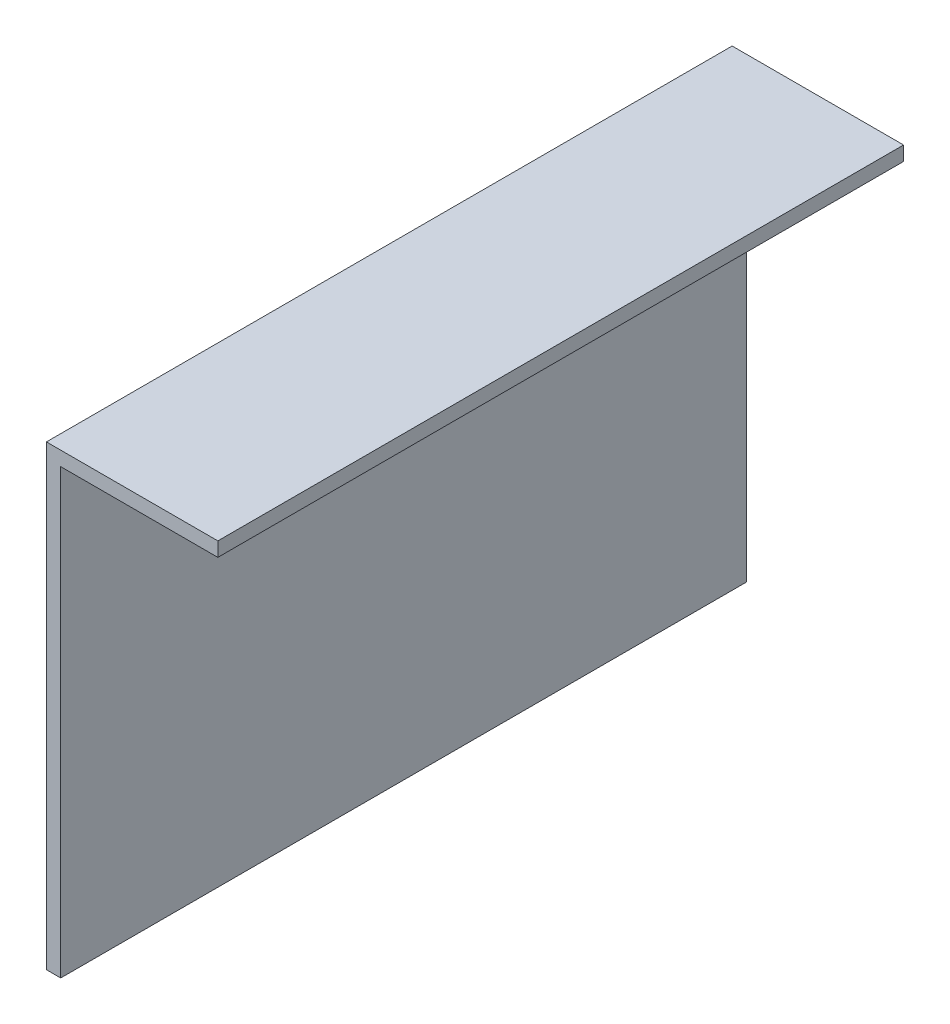
ISO-10303-21;
HEADER;
FILE_DESCRIPTION(('STEP AP214'),'2;1');
FILE_NAME('part.step','',(''),(''),'','','');
FILE_SCHEMA(('AUTOMOTIVE_DESIGN { 1 0 10303 214 1 1 1 1 }'));
ENDSEC;
DATA;
#1=APPLICATION_CONTEXT('core data for automotive mechanical design processes');
#2=APPLICATION_PROTOCOL_DEFINITION('international standard','automotive_design',2000,#1);
#3=PRODUCT_CONTEXT('',#1,'mechanical');
#4=PRODUCT('Part','Part','',(#3));
#5=PRODUCT_RELATED_PRODUCT_CATEGORY('part','',(#4));
#6=PRODUCT_DEFINITION_FORMATION('','',#4);
#7=PRODUCT_DEFINITION_CONTEXT('part definition',#1,'design');
#8=PRODUCT_DEFINITION('design','',#6,#7);
#9=PRODUCT_DEFINITION_SHAPE('','',#8);
#10=(LENGTH_UNIT() NAMED_UNIT(*) SI_UNIT(.MILLI.,.METRE.));
#11=(NAMED_UNIT(*) PLANE_ANGLE_UNIT() SI_UNIT($,.RADIAN.));
#12=(NAMED_UNIT(*) SI_UNIT($,.STERADIAN.) SOLID_ANGLE_UNIT());
#13=UNCERTAINTY_MEASURE_WITH_UNIT(LENGTH_MEASURE(1.E-05),#10,'distance_accuracy_value','');
#14=(GEOMETRIC_REPRESENTATION_CONTEXT(3) GLOBAL_UNCERTAINTY_ASSIGNED_CONTEXT((#13)) GLOBAL_UNIT_ASSIGNED_CONTEXT((#10,
#11,#12)) REPRESENTATION_CONTEXT('',''));
#15=CARTESIAN_POINT('',(0.,0.,0.));
#16=DIRECTION('',(0.,0.,1.));
#17=DIRECTION('',(1.,0.,0.));
#18=AXIS2_PLACEMENT_3D('',#15,#16,#17);
#19=CARTESIAN_POINT('',(-1.58749999999999,50.7999999999992,152.4));
#20=DIRECTION('',(0.,-1.,0.));
#21=DIRECTION('',(1.,0.,0.));
#22=AXIS2_PLACEMENT_3D('',#19,#20,#21);
#23=PLANE('',#22);
#24=DIRECTION('',(-1.,0.,0.));
#25=VECTOR('',#24,1.);
#26=CARTESIAN_POINT('',(-1.58749999999999,50.7999999999992,0.));
#27=LINE('',#26,#25);
#28=CARTESIAN_POINT('',(36.5125,50.7999999999991,0.));
#29=VERTEX_POINT('',#28);
#30=CARTESIAN_POINT('',(-1.58749999999999,50.7999999999992,0.));
#31=VERTEX_POINT('',#30);
#32=EDGE_CURVE('E117',#29,#31,#27,.T.);
#33=ORIENTED_EDGE('',*,*,#32,.T.);
#34=DIRECTION('',(0.,0.,-1.));
#35=VECTOR('',#34,1.);
#36=CARTESIAN_POINT('',(-1.58749999999999,50.7999999999992,152.4));
#37=LINE('',#36,#35);
#38=CARTESIAN_POINT('',(-1.58749999999999,50.7999999999992,152.4));
#39=VERTEX_POINT('',#38);
#40=EDGE_CURVE('E11',#39,#31,#37,.T.);
#41=ORIENTED_EDGE('',*,*,#40,.F.);
#42=DIRECTION('',(-1.,0.,0.));
#43=VECTOR('',#42,1.);
#44=CARTESIAN_POINT('',(-1.58749999999999,50.7999999999992,152.4));
#45=LINE('',#44,#43);
#46=CARTESIAN_POINT('',(36.5125,50.7999999999991,152.4));
#47=VERTEX_POINT('',#46);
#48=EDGE_CURVE('E127',#47,#39,#45,.T.);
#49=ORIENTED_EDGE('',*,*,#48,.F.);
#50=DIRECTION('',(0.,0.,-1.));
#51=VECTOR('',#50,1.);
#52=CARTESIAN_POINT('',(36.5125,50.7999999999991,152.4));
#53=LINE('',#52,#51);
#54=EDGE_CURVE('E113',#47,#29,#53,.T.);
#55=ORIENTED_EDGE('',*,*,#54,.T.);
#56=EDGE_LOOP('',(#33,#41,#49,#55));
#57=FACE_BOUND('',#56,.T.);
#58=ADVANCED_FACE('F33',(#57),#23,.F.);
#59=CARTESIAN_POINT('',(-1.58750000000001,-50.8000000000008,152.4));
#60=DIRECTION('',(1.,0.,0.));
#61=DIRECTION('',(0.,1.,0.));
#62=AXIS2_PLACEMENT_3D('',#59,#60,#61);
#63=PLANE('',#62);
#64=DIRECTION('',(0.,-1.,0.));
#65=VECTOR('',#64,1.);
#66=CARTESIAN_POINT('',(-1.58750000000001,-50.8000000000008,0.));
#67=LINE('',#66,#65);
#68=CARTESIAN_POINT('',(-1.58750000000001,-50.8000000000008,0.));
#69=VERTEX_POINT('',#68);
#70=EDGE_CURVE('E120',#31,#69,#67,.T.);
#71=ORIENTED_EDGE('',*,*,#70,.T.);
#72=DIRECTION('',(0.,0.,-1.));
#73=VECTOR('',#72,1.);
#74=CARTESIAN_POINT('',(-1.58750000000001,-50.8000000000008,152.4));
#75=LINE('',#74,#73);
#76=CARTESIAN_POINT('',(-1.58750000000001,-50.8000000000008,152.4));
#77=VERTEX_POINT('',#76);
#78=EDGE_CURVE('E41',#77,#69,#75,.T.);
#79=ORIENTED_EDGE('',*,*,#78,.F.);
#80=DIRECTION('',(0.,-1.,0.));
#81=VECTOR('',#80,1.);
#82=CARTESIAN_POINT('',(-1.58750000000001,-50.8000000000008,152.4));
#83=LINE('',#82,#81);
#84=EDGE_CURVE('E86',#39,#77,#83,.T.);
#85=ORIENTED_EDGE('',*,*,#84,.F.);
#86=ORIENTED_EDGE('',*,*,#40,.T.);
#87=EDGE_LOOP('',(#71,#79,#85,#86));
#88=FACE_BOUND('',#87,.T.);
#89=ADVANCED_FACE('F151',(#88),#63,.F.);
#90=CARTESIAN_POINT('',(1.58749999999999,-50.8000000000008,152.4));
#91=DIRECTION('',(0.,1.,0.));
#92=DIRECTION('',(-1.,0.,0.));
#93=AXIS2_PLACEMENT_3D('',#90,#91,#92);
#94=PLANE('',#93);
#95=DIRECTION('',(1.,0.,0.));
#96=VECTOR('',#95,1.);
#97=CARTESIAN_POINT('',(1.58749999999999,-50.8000000000008,0.));
#98=LINE('',#97,#96);
#99=CARTESIAN_POINT('',(1.58749999999999,-50.8000000000008,0.));
#100=VERTEX_POINT('',#99);
#101=EDGE_CURVE('E122',#69,#100,#98,.T.);
#102=ORIENTED_EDGE('',*,*,#101,.T.);
#103=DIRECTION('',(0.,0.,-1.));
#104=VECTOR('',#103,1.);
#105=CARTESIAN_POINT('',(1.58749999999999,-50.8000000000008,152.4));
#106=LINE('',#105,#104);
#107=CARTESIAN_POINT('',(1.58749999999999,-50.8000000000008,152.4));
#108=VERTEX_POINT('',#107);
#109=EDGE_CURVE('E108',#108,#100,#106,.T.);
#110=ORIENTED_EDGE('',*,*,#109,.F.);
#111=DIRECTION('',(1.,0.,0.));
#112=VECTOR('',#111,1.);
#113=CARTESIAN_POINT('',(1.58749999999999,-50.8000000000008,152.4));
#114=LINE('',#113,#112);
#115=EDGE_CURVE('E99',#77,#108,#114,.T.);
#116=ORIENTED_EDGE('',*,*,#115,.F.);
#117=ORIENTED_EDGE('',*,*,#78,.T.);
#118=EDGE_LOOP('',(#102,#110,#116,#117));
#119=FACE_BOUND('',#118,.T.);
#120=ADVANCED_FACE('F133',(#119),#94,.F.);
#121=CARTESIAN_POINT('',(1.58749999999999,-50.8000000000008,152.4));
#122=DIRECTION('',(-1.,0.,0.));
#123=DIRECTION('',(0.,-1.,0.));
#124=AXIS2_PLACEMENT_3D('',#121,#122,#123);
#125=PLANE('',#124);
#126=DIRECTION('',(0.,1.,0.));
#127=VECTOR('',#126,1.);
#128=CARTESIAN_POINT('',(1.58749999999999,-50.8000000000008,0.));
#129=LINE('',#128,#127);
#130=CARTESIAN_POINT('',(1.5875,47.6249999999991,0.));
#131=VERTEX_POINT('',#130);
#132=EDGE_CURVE('E107',#100,#131,#129,.T.);
#133=ORIENTED_EDGE('',*,*,#132,.T.);
#134=DIRECTION('',(0.,0.,-1.));
#135=VECTOR('',#134,1.);
#136=CARTESIAN_POINT('',(1.5875,47.6249999999991,152.4));
#137=LINE('',#136,#135);
#138=CARTESIAN_POINT('',(1.5875,47.6249999999991,152.4));
#139=VERTEX_POINT('',#138);
#140=EDGE_CURVE('E104',#139,#131,#137,.T.);
#141=ORIENTED_EDGE('',*,*,#140,.F.);
#142=DIRECTION('',(0.,1.,0.));
#143=VECTOR('',#142,1.);
#144=CARTESIAN_POINT('',(1.58749999999999,-50.8000000000008,152.4));
#145=LINE('',#144,#143);
#146=EDGE_CURVE('E93',#108,#139,#145,.T.);
#147=ORIENTED_EDGE('',*,*,#146,.F.);
#148=ORIENTED_EDGE('',*,*,#109,.T.);
#149=EDGE_LOOP('',(#133,#141,#147,#148));
#150=FACE_BOUND('',#149,.T.);
#151=ADVANCED_FACE('F105',(#150),#125,.F.);
#152=CARTESIAN_POINT('',(1.5875,47.6249999999991,152.4));
#153=DIRECTION('',(0.,1.,0.));
#154=DIRECTION('',(0.,0.,1.));
#155=AXIS2_PLACEMENT_3D('',#152,#153,#154);
#156=PLANE('',#155);
#157=DIRECTION('',(1.,0.,0.));
#158=VECTOR('',#157,1.);
#159=CARTESIAN_POINT('',(1.5875,47.6249999999991,0.));
#160=LINE('',#159,#158);
#161=CARTESIAN_POINT('',(36.5125,47.6249999999991,0.));
#162=VERTEX_POINT('',#161);
#163=EDGE_CURVE('E72',#131,#162,#160,.T.);
#164=ORIENTED_EDGE('',*,*,#163,.T.);
#165=DIRECTION('',(0.,0.,-1.));
#166=VECTOR('',#165,1.);
#167=CARTESIAN_POINT('',(36.5125,47.6249999999991,152.4));
#168=LINE('',#167,#166);
#169=CARTESIAN_POINT('',(36.5125,47.6249999999991,152.4));
#170=VERTEX_POINT('',#169);
#171=EDGE_CURVE('E109',#170,#162,#168,.T.);
#172=ORIENTED_EDGE('',*,*,#171,.F.);
#173=DIRECTION('',(1.,0.,0.));
#174=VECTOR('',#173,1.);
#175=CARTESIAN_POINT('',(1.5875,47.6249999999991,152.4));
#176=LINE('',#175,#174);
#177=EDGE_CURVE('E97',#139,#170,#176,.T.);
#178=ORIENTED_EDGE('',*,*,#177,.F.);
#179=ORIENTED_EDGE('',*,*,#140,.T.);
#180=EDGE_LOOP('',(#164,#172,#178,#179));
#181=FACE_BOUND('',#180,.T.);
#182=ADVANCED_FACE('F111',(#181),#156,.F.);
#183=CARTESIAN_POINT('',(36.5125,50.7999999999991,152.4));
#184=DIRECTION('',(-1.,0.,0.));
#185=DIRECTION('',(0.,0.,1.));
#186=AXIS2_PLACEMENT_3D('',#183,#184,#185);
#187=PLANE('',#186);
#188=DIRECTION('',(0.,1.,0.));
#189=VECTOR('',#188,1.);
#190=CARTESIAN_POINT('',(36.5125,50.7999999999991,0.));
#191=LINE('',#190,#189);
#192=EDGE_CURVE('E78',#162,#29,#191,.T.);
#193=ORIENTED_EDGE('',*,*,#192,.T.);
#194=ORIENTED_EDGE('',*,*,#54,.F.);
#195=DIRECTION('',(0.,1.,0.));
#196=VECTOR('',#195,1.);
#197=CARTESIAN_POINT('',(36.5125,50.7999999999991,152.4));
#198=LINE('',#197,#196);
#199=EDGE_CURVE('E49',#170,#47,#198,.T.);
#200=ORIENTED_EDGE('',*,*,#199,.F.);
#201=ORIENTED_EDGE('',*,*,#171,.T.);
#202=EDGE_LOOP('',(#193,#194,#200,#201));
#203=FACE_BOUND('',#202,.T.);
#204=ADVANCED_FACE('F140',(#203),#187,.F.);
#205=CARTESIAN_POINT('',(0.,0.,152.4));
#206=DIRECTION('',(0.,0.,-1.));
#207=DIRECTION('',(-1.,0.,0.));
#208=AXIS2_PLACEMENT_3D('',#205,#206,#207);
#209=PLANE('',#208);
#210=ORIENTED_EDGE('',*,*,#48,.T.);
#211=ORIENTED_EDGE('',*,*,#84,.T.);
#212=ORIENTED_EDGE('',*,*,#115,.T.);
#213=ORIENTED_EDGE('',*,*,#146,.T.);
#214=ORIENTED_EDGE('',*,*,#177,.T.);
#215=ORIENTED_EDGE('',*,*,#199,.T.);
#216=EDGE_LOOP('',(#210,#211,#212,#213,#214,#215));
#217=FACE_BOUND('',#216,.T.);
#218=ADVANCED_FACE('F95',(#217),#209,.F.);
#219=CARTESIAN_POINT('',(0.,0.,0.));
#220=DIRECTION('',(0.,0.,-1.));
#221=DIRECTION('',(-1.,0.,0.));
#222=AXIS2_PLACEMENT_3D('',#219,#220,#221);
#223=PLANE('',#222);
#224=ORIENTED_EDGE('',*,*,#32,.F.);
#225=ORIENTED_EDGE('',*,*,#192,.F.);
#226=ORIENTED_EDGE('',*,*,#163,.F.);
#227=ORIENTED_EDGE('',*,*,#132,.F.);
#228=ORIENTED_EDGE('',*,*,#101,.F.);
#229=ORIENTED_EDGE('',*,*,#70,.F.);
#230=EDGE_LOOP('',(#224,#225,#226,#227,#228,#229));
#231=FACE_BOUND('',#230,.T.);
#232=ADVANCED_FACE('F136',(#231),#223,.T.);
#233=CLOSED_SHELL('',(#58,#89,#120,#151,#182,#204,#218,#232));
#234=MANIFOLD_SOLID_BREP('B2',#233);
#235=ADVANCED_BREP_SHAPE_REPRESENTATION('',(#18,#234),#14);
#236=SHAPE_DEFINITION_REPRESENTATION(#9,#235);
ENDSEC;
END-ISO-10303-21;
